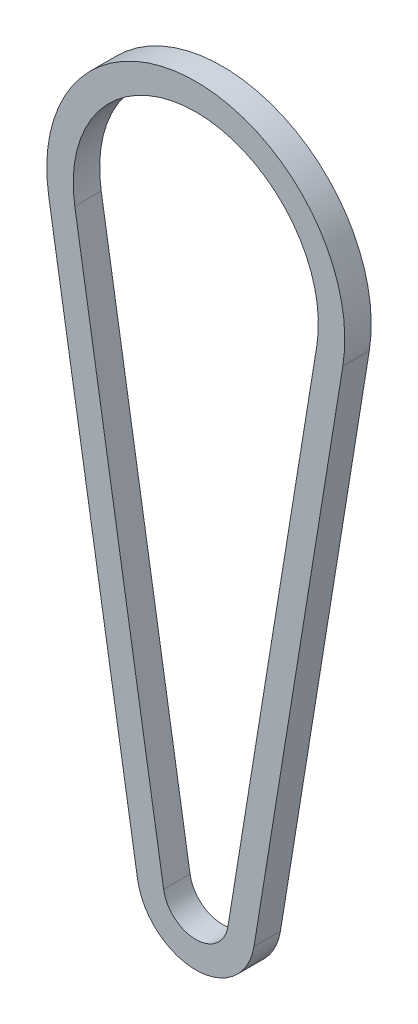
ISO-10303-21;
HEADER;
FILE_DESCRIPTION(('STEP AP214'),'2;1');
FILE_NAME('part.step','',(''),(''),'','','');
FILE_SCHEMA(('AUTOMOTIVE_DESIGN { 1 0 10303 214 1 1 1 1 }'));
ENDSEC;
DATA;
#1=APPLICATION_CONTEXT('core data for automotive mechanical design processes');
#2=APPLICATION_PROTOCOL_DEFINITION('international standard','automotive_design',2000,#1);
#3=PRODUCT_CONTEXT('',#1,'mechanical');
#4=PRODUCT('Part','Part','',(#3));
#5=PRODUCT_RELATED_PRODUCT_CATEGORY('part','',(#4));
#6=PRODUCT_DEFINITION_FORMATION('','',#4);
#7=PRODUCT_DEFINITION_CONTEXT('part definition',#1,'design');
#8=PRODUCT_DEFINITION('design','',#6,#7);
#9=PRODUCT_DEFINITION_SHAPE('','',#8);
#10=(LENGTH_UNIT() NAMED_UNIT(*) SI_UNIT(.MILLI.,.METRE.));
#11=(NAMED_UNIT(*) PLANE_ANGLE_UNIT() SI_UNIT($,.RADIAN.));
#12=(NAMED_UNIT(*) SI_UNIT($,.STERADIAN.) SOLID_ANGLE_UNIT());
#13=UNCERTAINTY_MEASURE_WITH_UNIT(LENGTH_MEASURE(1.E-05),#10,'distance_accuracy_value','');
#14=(GEOMETRIC_REPRESENTATION_CONTEXT(3) GLOBAL_UNCERTAINTY_ASSIGNED_CONTEXT((#13)) GLOBAL_UNIT_ASSIGNED_CONTEXT((#10,
#11,#12)) REPRESENTATION_CONTEXT('',''));
#15=CARTESIAN_POINT('',(0.,0.,0.));
#16=DIRECTION('',(0.,0.,1.));
#17=DIRECTION('',(1.,0.,0.));
#18=AXIS2_PLACEMENT_3D('',#15,#16,#17);
#19=CARTESIAN_POINT('',(0.,215.9,10.16));
#20=DIRECTION('',(0.,0.,-1.));
#21=DIRECTION('',(-1.,0.,0.));
#22=AXIS2_PLACEMENT_3D('',#19,#20,#21);
#23=PLANE('',#22);
#24=CARTESIAN_POINT('',(0.,215.9,10.16));
#25=DIRECTION('',(0.,0.,1.));
#26=DIRECTION('',(-1.,0.,0.));
#27=AXIS2_PLACEMENT_3D('',#24,#25,#26);
#28=CIRCLE('',#27,57.2897);
#29=CARTESIAN_POINT('',(56.5489038685787,206.716798088235,10.16));
#30=VERTEX_POINT('',#29);
#31=CARTESIAN_POINT('',(-56.5489038685788,206.716798088235,10.16));
#32=VERTEX_POINT('',#31);
#33=EDGE_CURVE('E135',#30,#32,#28,.T.);
#34=ORIENTED_EDGE('',*,*,#33,.T.);
#35=DIRECTION('',(0.160294117647059,-0.987069296375767,0.));
#36=VECTOR('',#35,1.);
#37=CARTESIAN_POINT('',(-56.5489038685788,206.716798088235,10.16));
#38=LINE('',#37,#36);
#39=CARTESIAN_POINT('',(-22.3889031942544,-3.63582323529412,10.16));
#40=VERTEX_POINT('',#39);
#41=EDGE_CURVE('E138',#32,#40,#38,.T.);
#42=ORIENTED_EDGE('',*,*,#41,.T.);
#43=CARTESIAN_POINT('',(0.,0.,10.16));
#44=DIRECTION('',(0.,0.,1.));
#45=DIRECTION('',(-1.,0.,0.));
#46=AXIS2_PLACEMENT_3D('',#43,#44,#45);
#47=CIRCLE('',#46,22.6822);
#48=CARTESIAN_POINT('',(22.3889031942544,-3.63582323529412,10.16));
#49=VERTEX_POINT('',#48);
#50=EDGE_CURVE('E141',#40,#49,#47,.T.);
#51=ORIENTED_EDGE('',*,*,#50,.T.);
#52=DIRECTION('',(0.160294117647059,0.987069296375767,0.));
#53=VECTOR('',#52,1.);
#54=CARTESIAN_POINT('',(56.5489038685787,206.716798088235,10.16));
#55=LINE('',#54,#53);
#56=EDGE_CURVE('E143',#49,#30,#55,.T.);
#57=ORIENTED_EDGE('',*,*,#56,.T.);
#58=EDGE_LOOP('',(#34,#42,#51,#57));
#59=FACE_BOUND('',#58,.T.);
#60=CARTESIAN_POINT('',(0.,215.9,10.16));
#61=DIRECTION('',(0.,0.,1.));
#62=DIRECTION('',(-1.,0.,0.));
#63=AXIS2_PLACEMENT_3D('',#60,#61,#62);
#64=CIRCLE('',#63,47.1297);
#65=CARTESIAN_POINT('',(46.520279817401,208.345386323529,10.16));
#66=VERTEX_POINT('',#65);
#67=CARTESIAN_POINT('',(-46.520279817401,208.345386323529,10.16));
#68=VERTEX_POINT('',#67);
#69=EDGE_CURVE('E99',#66,#68,#64,.T.);
#70=ORIENTED_EDGE('',*,*,#69,.F.);
#71=DIRECTION('',(0.160294117647059,0.987069296375766,0.));
#72=VECTOR('',#71,1.);
#73=CARTESIAN_POINT('',(46.520279817401,208.345386323529,10.16));
#74=LINE('',#73,#72);
#75=CARTESIAN_POINT('',(12.3602791430766,-2.007235,10.16));
#76=VERTEX_POINT('',#75);
#77=EDGE_CURVE('E121',#76,#66,#74,.T.);
#78=ORIENTED_EDGE('',*,*,#77,.F.);
#79=CARTESIAN_POINT('',(0.,0.,10.16));
#80=DIRECTION('',(0.,0.,1.));
#81=DIRECTION('',(-1.,0.,0.));
#82=AXIS2_PLACEMENT_3D('',#79,#80,#81);
#83=CIRCLE('',#82,12.5222);
#84=CARTESIAN_POINT('',(-12.3602791430766,-2.00723499999998,10.16));
#85=VERTEX_POINT('',#84);
#86=EDGE_CURVE('E119',#85,#76,#83,.T.);
#87=ORIENTED_EDGE('',*,*,#86,.F.);
#88=DIRECTION('',(0.160294117647059,-0.987069296375767,0.));
#89=VECTOR('',#88,1.);
#90=CARTESIAN_POINT('',(-46.520279817401,208.345386323529,10.16));
#91=LINE('',#90,#89);
#92=EDGE_CURVE('E107',#68,#85,#91,.T.);
#93=ORIENTED_EDGE('',*,*,#92,.F.);
#94=EDGE_LOOP('',(#70,#78,#87,#93));
#95=FACE_BOUND('',#94,.T.);
#96=ADVANCED_FACE('F34',(#59,#95),#23,.F.);
#97=CARTESIAN_POINT('',(0.,215.9,0.));
#98=DIRECTION('',(0.,0.,-1.));
#99=DIRECTION('',(-1.,0.,0.));
#100=AXIS2_PLACEMENT_3D('',#97,#98,#99);
#101=PLANE('',#100);
#102=CARTESIAN_POINT('',(0.,215.9,0.));
#103=DIRECTION('',(0.,0.,1.));
#104=DIRECTION('',(-1.,0.,0.));
#105=AXIS2_PLACEMENT_3D('',#102,#103,#104);
#106=CIRCLE('',#105,57.2897);
#107=CARTESIAN_POINT('',(56.5489038685787,206.716798088235,0.));
#108=VERTEX_POINT('',#107);
#109=CARTESIAN_POINT('',(-56.5489038685788,206.716798088235,0.));
#110=VERTEX_POINT('',#109);
#111=EDGE_CURVE('E115',#108,#110,#106,.T.);
#112=ORIENTED_EDGE('',*,*,#111,.F.);
#113=DIRECTION('',(0.160294117647059,0.987069296375767,0.));
#114=VECTOR('',#113,1.);
#115=CARTESIAN_POINT('',(56.5489038685787,206.716798088235,0.));
#116=LINE('',#115,#114);
#117=CARTESIAN_POINT('',(22.3889031942544,-3.63582323529412,0.));
#118=VERTEX_POINT('',#117);
#119=EDGE_CURVE('E139',#118,#108,#116,.T.);
#120=ORIENTED_EDGE('',*,*,#119,.F.);
#121=CARTESIAN_POINT('',(0.,0.,0.));
#122=DIRECTION('',(0.,0.,1.));
#123=DIRECTION('',(-1.,0.,0.));
#124=AXIS2_PLACEMENT_3D('',#121,#122,#123);
#125=CIRCLE('',#124,22.6822);
#126=CARTESIAN_POINT('',(-22.3889031942544,-3.63582323529412,0.));
#127=VERTEX_POINT('',#126);
#128=EDGE_CURVE('E150',#127,#118,#125,.T.);
#129=ORIENTED_EDGE('',*,*,#128,.F.);
#130=DIRECTION('',(0.160294117647059,-0.987069296375767,0.));
#131=VECTOR('',#130,1.);
#132=CARTESIAN_POINT('',(-56.5489038685788,206.716798088235,0.));
#133=LINE('',#132,#131);
#134=EDGE_CURVE('E148',#110,#127,#133,.T.);
#135=ORIENTED_EDGE('',*,*,#134,.F.);
#136=EDGE_LOOP('',(#112,#120,#129,#135));
#137=FACE_BOUND('',#136,.T.);
#138=DIRECTION('',(0.160294117647059,0.987069296375766,0.));
#139=VECTOR('',#138,1.);
#140=CARTESIAN_POINT('',(46.520279817401,208.345386323529,0.));
#141=LINE('',#140,#139);
#142=CARTESIAN_POINT('',(12.3602791430766,-2.00723500000001,0.));
#143=VERTEX_POINT('',#142);
#144=CARTESIAN_POINT('',(46.520279817401,208.345386323529,0.));
#145=VERTEX_POINT('',#144);
#146=EDGE_CURVE('E108',#143,#145,#141,.T.);
#147=ORIENTED_EDGE('',*,*,#146,.T.);
#148=CARTESIAN_POINT('',(0.,215.9,0.));
#149=DIRECTION('',(0.,0.,1.));
#150=DIRECTION('',(-1.,0.,0.));
#151=AXIS2_PLACEMENT_3D('',#148,#149,#150);
#152=CIRCLE('',#151,47.1297);
#153=CARTESIAN_POINT('',(-46.520279817401,208.345386323529,0.));
#154=VERTEX_POINT('',#153);
#155=EDGE_CURVE('E57',#145,#154,#152,.T.);
#156=ORIENTED_EDGE('',*,*,#155,.T.);
#157=DIRECTION('',(0.160294117647059,-0.987069296375767,0.));
#158=VECTOR('',#157,1.);
#159=CARTESIAN_POINT('',(-46.520279817401,208.345386323529,0.));
#160=LINE('',#159,#158);
#161=CARTESIAN_POINT('',(-12.3602791430766,-2.00723499999998,0.));
#162=VERTEX_POINT('',#161);
#163=EDGE_CURVE('E114',#154,#162,#160,.T.);
#164=ORIENTED_EDGE('',*,*,#163,.T.);
#165=CARTESIAN_POINT('',(0.,0.,0.));
#166=DIRECTION('',(0.,0.,1.));
#167=DIRECTION('',(-1.,0.,0.));
#168=AXIS2_PLACEMENT_3D('',#165,#166,#167);
#169=CIRCLE('',#168,12.5222);
#170=EDGE_CURVE('E127',#162,#143,#169,.T.);
#171=ORIENTED_EDGE('',*,*,#170,.T.);
#172=EDGE_LOOP('',(#147,#156,#164,#171));
#173=FACE_BOUND('',#172,.T.);
#174=ADVANCED_FACE('F168',(#137,#173),#101,.T.);
#175=CARTESIAN_POINT('',(0.,215.9,10.16));
#176=DIRECTION('',(0.,0.,-1.));
#177=DIRECTION('',(-1.,0.,0.));
#178=AXIS2_PLACEMENT_3D('',#175,#176,#177);
#179=CYLINDRICAL_SURFACE('',#178,57.2897);
#180=ORIENTED_EDGE('',*,*,#111,.T.);
#181=DIRECTION('',(0.,0.,-1.));
#182=VECTOR('',#181,1.);
#183=CARTESIAN_POINT('',(-56.5489038685788,206.716798088235,10.16));
#184=LINE('',#183,#182);
#185=EDGE_CURVE('E11',#32,#110,#184,.T.);
#186=ORIENTED_EDGE('',*,*,#185,.F.);
#187=ORIENTED_EDGE('',*,*,#33,.F.);
#188=DIRECTION('',(0.,0.,-1.));
#189=VECTOR('',#188,1.);
#190=CARTESIAN_POINT('',(56.5489038685787,206.716798088235,10.16));
#191=LINE('',#190,#189);
#192=EDGE_CURVE('E145',#30,#108,#191,.T.);
#193=ORIENTED_EDGE('',*,*,#192,.T.);
#194=EDGE_LOOP('',(#180,#186,#187,#193));
#195=FACE_BOUND('',#194,.T.);
#196=ADVANCED_FACE('F36',(#195),#179,.T.);
#197=CARTESIAN_POINT('',(-56.5489038685788,206.716798088235,10.16));
#198=DIRECTION('',(0.987069296375767,0.160294117647059,0.));
#199=DIRECTION('',(-0.160294117647059,0.987069296375767,0.));
#200=AXIS2_PLACEMENT_3D('',#197,#198,#199);
#201=PLANE('',#200);
#202=ORIENTED_EDGE('',*,*,#134,.T.);
#203=DIRECTION('',(0.,0.,-1.));
#204=VECTOR('',#203,1.);
#205=CARTESIAN_POINT('',(-22.3889031942544,-3.63582323529412,10.16));
#206=LINE('',#205,#204);
#207=EDGE_CURVE('E42',#40,#127,#206,.T.);
#208=ORIENTED_EDGE('',*,*,#207,.F.);
#209=ORIENTED_EDGE('',*,*,#41,.F.);
#210=ORIENTED_EDGE('',*,*,#185,.T.);
#211=EDGE_LOOP('',(#202,#208,#209,#210));
#212=FACE_BOUND('',#211,.T.);
#213=ADVANCED_FACE('F178',(#212),#201,.F.);
#214=CARTESIAN_POINT('',(0.,0.,10.16));
#215=DIRECTION('',(0.,0.,-1.));
#216=DIRECTION('',(-1.,0.,0.));
#217=AXIS2_PLACEMENT_3D('',#214,#215,#216);
#218=CYLINDRICAL_SURFACE('',#217,22.6822);
#219=ORIENTED_EDGE('',*,*,#128,.T.);
#220=DIRECTION('',(0.,0.,-1.));
#221=VECTOR('',#220,1.);
#222=CARTESIAN_POINT('',(22.3889031942544,-3.63582323529412,10.16));
#223=LINE('',#222,#221);
#224=EDGE_CURVE('E155',#49,#118,#223,.T.);
#225=ORIENTED_EDGE('',*,*,#224,.F.);
#226=ORIENTED_EDGE('',*,*,#50,.F.);
#227=ORIENTED_EDGE('',*,*,#207,.T.);
#228=EDGE_LOOP('',(#219,#225,#226,#227));
#229=FACE_BOUND('',#228,.T.);
#230=ADVANCED_FACE('F162',(#229),#218,.T.);
#231=CARTESIAN_POINT('',(56.5489038685787,206.716798088235,10.16));
#232=DIRECTION('',(-0.987069296375767,0.160294117647059,0.));
#233=DIRECTION('',(-0.160294117647059,-0.987069296375767,0.));
#234=AXIS2_PLACEMENT_3D('',#231,#232,#233);
#235=PLANE('',#234);
#236=ORIENTED_EDGE('',*,*,#119,.T.);
#237=ORIENTED_EDGE('',*,*,#192,.F.);
#238=ORIENTED_EDGE('',*,*,#56,.F.);
#239=ORIENTED_EDGE('',*,*,#224,.T.);
#240=EDGE_LOOP('',(#236,#237,#238,#239));
#241=FACE_BOUND('',#240,.T.);
#242=ADVANCED_FACE('F172',(#241),#235,.F.);
#243=CARTESIAN_POINT('',(0.,215.9,10.16));
#244=DIRECTION('',(0.,0.,-1.));
#245=DIRECTION('',(-1.,0.,0.));
#246=AXIS2_PLACEMENT_3D('',#243,#244,#245);
#247=CYLINDRICAL_SURFACE('',#246,47.1297);
#248=ORIENTED_EDGE('',*,*,#155,.F.);
#249=DIRECTION('',(0.,0.,-1.));
#250=VECTOR('',#249,1.);
#251=CARTESIAN_POINT('',(46.520279817401,208.345386323529,10.16));
#252=LINE('',#251,#250);
#253=EDGE_CURVE('E103',#66,#145,#252,.T.);
#254=ORIENTED_EDGE('',*,*,#253,.F.);
#255=ORIENTED_EDGE('',*,*,#69,.T.);
#256=DIRECTION('',(0.,0.,-1.));
#257=VECTOR('',#256,1.);
#258=CARTESIAN_POINT('',(-46.520279817401,208.345386323529,10.16));
#259=LINE('',#258,#257);
#260=EDGE_CURVE('E102',#68,#154,#259,.T.);
#261=ORIENTED_EDGE('',*,*,#260,.T.);
#262=EDGE_LOOP('',(#248,#254,#255,#261));
#263=FACE_BOUND('',#262,.T.);
#264=ADVANCED_FACE('F101',(#263),#247,.F.);
#265=CARTESIAN_POINT('',(-46.520279817401,208.345386323529,10.16));
#266=DIRECTION('',(0.987069296375767,0.160294117647059,0.));
#267=DIRECTION('',(-0.160294117647059,0.987069296375767,0.));
#268=AXIS2_PLACEMENT_3D('',#265,#266,#267);
#269=PLANE('',#268);
#270=ORIENTED_EDGE('',*,*,#163,.F.);
#271=ORIENTED_EDGE('',*,*,#260,.F.);
#272=ORIENTED_EDGE('',*,*,#92,.T.);
#273=DIRECTION('',(0.,0.,-1.));
#274=VECTOR('',#273,1.);
#275=CARTESIAN_POINT('',(-12.3602791430766,-2.00723499999998,10.16));
#276=LINE('',#275,#274);
#277=EDGE_CURVE('E116',#85,#162,#276,.T.);
#278=ORIENTED_EDGE('',*,*,#277,.T.);
#279=EDGE_LOOP('',(#270,#271,#272,#278));
#280=FACE_BOUND('',#279,.T.);
#281=ADVANCED_FACE('F111',(#280),#269,.T.);
#282=CARTESIAN_POINT('',(0.,0.,10.16));
#283=DIRECTION('',(0.,0.,-1.));
#284=DIRECTION('',(-1.,0.,0.));
#285=AXIS2_PLACEMENT_3D('',#282,#283,#284);
#286=CYLINDRICAL_SURFACE('',#285,12.5222);
#287=ORIENTED_EDGE('',*,*,#170,.F.);
#288=ORIENTED_EDGE('',*,*,#277,.F.);
#289=ORIENTED_EDGE('',*,*,#86,.T.);
#290=DIRECTION('',(0.,0.,-1.));
#291=VECTOR('',#290,1.);
#292=CARTESIAN_POINT('',(12.3602791430766,-2.00723500000001,10.16));
#293=LINE('',#292,#291);
#294=EDGE_CURVE('E49',#76,#143,#293,.T.);
#295=ORIENTED_EDGE('',*,*,#294,.T.);
#296=EDGE_LOOP('',(#287,#288,#289,#295));
#297=FACE_BOUND('',#296,.T.);
#298=ADVANCED_FACE('F201',(#297),#286,.F.);
#299=CARTESIAN_POINT('',(46.520279817401,208.345386323529,10.16));
#300=DIRECTION('',(-0.987069296375767,0.160294117647059,0.));
#301=DIRECTION('',(-0.160294117647059,-0.987069296375767,0.));
#302=AXIS2_PLACEMENT_3D('',#299,#300,#301);
#303=PLANE('',#302);
#304=ORIENTED_EDGE('',*,*,#146,.F.);
#305=ORIENTED_EDGE('',*,*,#294,.F.);
#306=ORIENTED_EDGE('',*,*,#77,.T.);
#307=ORIENTED_EDGE('',*,*,#253,.T.);
#308=EDGE_LOOP('',(#304,#305,#306,#307));
#309=FACE_BOUND('',#308,.T.);
#310=ADVANCED_FACE('F205',(#309),#303,.T.);
#311=CLOSED_SHELL('',(#96,#174,#196,#213,#230,#242,#264,#281,#298,#310));
#312=MANIFOLD_SOLID_BREP('B2',#311);
#313=ADVANCED_BREP_SHAPE_REPRESENTATION('',(#18,#312),#14);
#314=SHAPE_DEFINITION_REPRESENTATION(#9,#313);
ENDSEC;
END-ISO-10303-21;
